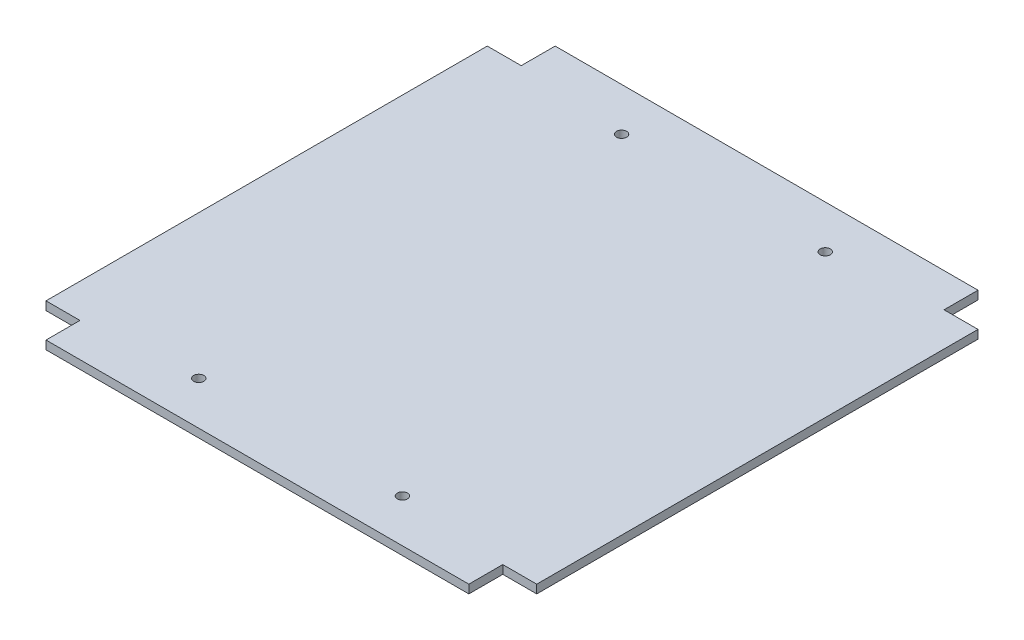
ISO-10303-21;
HEADER;
FILE_DESCRIPTION(('STEP AP214'),'2;1');
FILE_NAME('part.step','',(''),(''),'','','');
FILE_SCHEMA(('AUTOMOTIVE_DESIGN { 1 0 10303 214 1 1 1 1 }'));
ENDSEC;
DATA;
#1=APPLICATION_CONTEXT('core data for automotive mechanical design processes');
#2=APPLICATION_PROTOCOL_DEFINITION('international standard','automotive_design',2000,#1);
#3=PRODUCT_CONTEXT('',#1,'mechanical');
#4=PRODUCT('Part','Part','',(#3));
#5=PRODUCT_RELATED_PRODUCT_CATEGORY('part','',(#4));
#6=PRODUCT_DEFINITION_FORMATION('','',#4);
#7=PRODUCT_DEFINITION_CONTEXT('part definition',#1,'design');
#8=PRODUCT_DEFINITION('design','',#6,#7);
#9=PRODUCT_DEFINITION_SHAPE('','',#8);
#10=(LENGTH_UNIT() NAMED_UNIT(*) SI_UNIT(.MILLI.,.METRE.));
#11=(NAMED_UNIT(*) PLANE_ANGLE_UNIT() SI_UNIT($,.RADIAN.));
#12=(NAMED_UNIT(*) SI_UNIT($,.STERADIAN.) SOLID_ANGLE_UNIT());
#13=UNCERTAINTY_MEASURE_WITH_UNIT(LENGTH_MEASURE(1.E-05),#10,'distance_accuracy_value','');
#14=(GEOMETRIC_REPRESENTATION_CONTEXT(3) GLOBAL_UNCERTAINTY_ASSIGNED_CONTEXT((#13)) GLOBAL_UNIT_ASSIGNED_CONTEXT((#10,
#11,#12)) REPRESENTATION_CONTEXT('',''));
#15=CARTESIAN_POINT('',(0.,0.,0.));
#16=DIRECTION('',(0.,0.,1.));
#17=DIRECTION('',(1.,0.,0.));
#18=AXIS2_PLACEMENT_3D('',#15,#16,#17);
#19=CARTESIAN_POINT('',(-144.56832294801,5.,0.));
#20=DIRECTION('',(-1.,0.,0.));
#21=DIRECTION('',(0.,0.,1.));
#22=AXIS2_PLACEMENT_3D('',#19,#20,#21);
#23=PLANE('',#22);
#24=DIRECTION('',(0.,0.,-1.));
#25=VECTOR('',#24,1.);
#26=CARTESIAN_POINT('',(-144.56832294801,0.,0.));
#27=LINE('',#26,#25);
#28=CARTESIAN_POINT('',(-144.56832294801,0.,130.));
#29=VERTEX_POINT('',#28);
#30=CARTESIAN_POINT('',(-144.56832294801,0.,-130.));
#31=VERTEX_POINT('',#30);
#32=EDGE_CURVE('E169',#29,#31,#27,.T.);
#33=ORIENTED_EDGE('',*,*,#32,.F.);
#34=DIRECTION('',(0.,-1.,0.));
#35=VECTOR('',#34,1.);
#36=CARTESIAN_POINT('',(-144.56832294801,5.,130.));
#37=LINE('',#36,#35);
#38=CARTESIAN_POINT('',(-144.56832294801,5.,130.));
#39=VERTEX_POINT('',#38);
#40=EDGE_CURVE('E11',#39,#29,#37,.T.);
#41=ORIENTED_EDGE('',*,*,#40,.F.);
#42=DIRECTION('',(0.,0.,-1.));
#43=VECTOR('',#42,1.);
#44=CARTESIAN_POINT('',(-144.56832294801,5.,0.));
#45=LINE('',#44,#43);
#46=CARTESIAN_POINT('',(-144.56832294801,5.,-130.));
#47=VERTEX_POINT('',#46);
#48=EDGE_CURVE('E211',#39,#47,#45,.T.);
#49=ORIENTED_EDGE('',*,*,#48,.T.);
#50=DIRECTION('',(0.,-1.,0.));
#51=VECTOR('',#50,1.);
#52=CARTESIAN_POINT('',(-144.56832294801,5.,-130.));
#53=LINE('',#52,#51);
#54=EDGE_CURVE('E55',#47,#31,#53,.T.);
#55=ORIENTED_EDGE('',*,*,#54,.T.);
#56=EDGE_LOOP('',(#33,#41,#49,#55));
#57=FACE_BOUND('',#56,.T.);
#58=ADVANCED_FACE('F39',(#57),#23,.T.);
#59=CARTESIAN_POINT('',(0.,5.,130.));
#60=DIRECTION('',(0.,0.,-1.));
#61=DIRECTION('',(-1.,0.,0.));
#62=AXIS2_PLACEMENT_3D('',#59,#60,#61);
#63=PLANE('',#62);
#64=DIRECTION('',(1.,0.,0.));
#65=VECTOR('',#64,1.);
#66=CARTESIAN_POINT('',(0.,0.,130.));
#67=LINE('',#66,#65);
#68=CARTESIAN_POINT('',(-124.56832294801,0.,130.));
#69=VERTEX_POINT('',#68);
#70=EDGE_CURVE('E171',#29,#69,#67,.T.);
#71=ORIENTED_EDGE('',*,*,#70,.T.);
#72=DIRECTION('',(0.,-1.,0.));
#73=VECTOR('',#72,1.);
#74=CARTESIAN_POINT('',(-124.56832294801,5.,130.));
#75=LINE('',#74,#73);
#76=CARTESIAN_POINT('',(-124.56832294801,5.,130.));
#77=VERTEX_POINT('',#76);
#78=EDGE_CURVE('E47',#77,#69,#75,.T.);
#79=ORIENTED_EDGE('',*,*,#78,.F.);
#80=DIRECTION('',(1.,0.,0.));
#81=VECTOR('',#80,1.);
#82=CARTESIAN_POINT('',(0.,5.,130.));
#83=LINE('',#82,#81);
#84=EDGE_CURVE('E253',#39,#77,#83,.T.);
#85=ORIENTED_EDGE('',*,*,#84,.F.);
#86=ORIENTED_EDGE('',*,*,#40,.T.);
#87=EDGE_LOOP('',(#71,#79,#85,#86));
#88=FACE_BOUND('',#87,.T.);
#89=ADVANCED_FACE('F289',(#88),#63,.F.);
#90=CARTESIAN_POINT('',(-124.56832294801,5.,0.));
#91=DIRECTION('',(1.,0.,0.));
#92=DIRECTION('',(0.,0.,-1.));
#93=AXIS2_PLACEMENT_3D('',#90,#91,#92);
#94=PLANE('',#93);
#95=DIRECTION('',(0.,0.,1.));
#96=VECTOR('',#95,1.);
#97=CARTESIAN_POINT('',(-124.56832294801,0.,0.));
#98=LINE('',#97,#96);
#99=CARTESIAN_POINT('',(-124.56832294801,0.,150.));
#100=VERTEX_POINT('',#99);
#101=EDGE_CURVE('E173',#69,#100,#98,.T.);
#102=ORIENTED_EDGE('',*,*,#101,.T.);
#103=DIRECTION('',(0.,-1.,0.));
#104=VECTOR('',#103,1.);
#105=CARTESIAN_POINT('',(-124.56832294801,5.,150.));
#106=LINE('',#105,#104);
#107=CARTESIAN_POINT('',(-124.56832294801,5.,150.));
#108=VERTEX_POINT('',#107);
#109=EDGE_CURVE('E226',#108,#100,#106,.T.);
#110=ORIENTED_EDGE('',*,*,#109,.F.);
#111=DIRECTION('',(0.,0.,1.));
#112=VECTOR('',#111,1.);
#113=CARTESIAN_POINT('',(-124.56832294801,5.,0.));
#114=LINE('',#113,#112);
#115=EDGE_CURVE('E234',#77,#108,#114,.T.);
#116=ORIENTED_EDGE('',*,*,#115,.F.);
#117=ORIENTED_EDGE('',*,*,#78,.T.);
#118=EDGE_LOOP('',(#102,#110,#116,#117));
#119=FACE_BOUND('',#118,.T.);
#120=ADVANCED_FACE('F232',(#119),#94,.F.);
#121=CARTESIAN_POINT('',(0.,5.,150.));
#122=DIRECTION('',(0.,0.,1.));
#123=DIRECTION('',(1.,0.,0.));
#124=AXIS2_PLACEMENT_3D('',#121,#122,#123);
#125=PLANE('',#124);
#126=DIRECTION('',(-1.,0.,0.));
#127=VECTOR('',#126,1.);
#128=CARTESIAN_POINT('',(0.,0.,150.));
#129=LINE('',#128,#127);
#130=CARTESIAN_POINT('',(124.56832294801,0.,150.));
#131=VERTEX_POINT('',#130);
#132=EDGE_CURVE('E176',#131,#100,#129,.T.);
#133=ORIENTED_EDGE('',*,*,#132,.F.);
#134=DIRECTION('',(0.,-1.,0.));
#135=VECTOR('',#134,1.);
#136=CARTESIAN_POINT('',(124.56832294801,5.,150.));
#137=LINE('',#136,#135);
#138=CARTESIAN_POINT('',(124.56832294801,5.,150.));
#139=VERTEX_POINT('',#138);
#140=EDGE_CURVE('E224',#139,#131,#137,.T.);
#141=ORIENTED_EDGE('',*,*,#140,.F.);
#142=DIRECTION('',(-1.,0.,0.));
#143=VECTOR('',#142,1.);
#144=CARTESIAN_POINT('',(0.,5.,150.));
#145=LINE('',#144,#143);
#146=EDGE_CURVE('E246',#139,#108,#145,.T.);
#147=ORIENTED_EDGE('',*,*,#146,.T.);
#148=ORIENTED_EDGE('',*,*,#109,.T.);
#149=EDGE_LOOP('',(#133,#141,#147,#148));
#150=FACE_BOUND('',#149,.T.);
#151=ADVANCED_FACE('F243',(#150),#125,.T.);
#152=CARTESIAN_POINT('',(124.56832294801,5.,0.));
#153=DIRECTION('',(1.,0.,0.));
#154=DIRECTION('',(0.,0.,-1.));
#155=AXIS2_PLACEMENT_3D('',#152,#153,#154);
#156=PLANE('',#155);
#157=DIRECTION('',(0.,0.,1.));
#158=VECTOR('',#157,1.);
#159=CARTESIAN_POINT('',(124.56832294801,0.,0.));
#160=LINE('',#159,#158);
#161=CARTESIAN_POINT('',(124.56832294801,0.,130.));
#162=VERTEX_POINT('',#161);
#163=EDGE_CURVE('E179',#162,#131,#160,.T.);
#164=ORIENTED_EDGE('',*,*,#163,.F.);
#165=DIRECTION('',(0.,-1.,0.));
#166=VECTOR('',#165,1.);
#167=CARTESIAN_POINT('',(124.56832294801,5.,130.));
#168=LINE('',#167,#166);
#169=CARTESIAN_POINT('',(124.56832294801,5.,130.));
#170=VERTEX_POINT('',#169);
#171=EDGE_CURVE('E222',#170,#162,#168,.T.);
#172=ORIENTED_EDGE('',*,*,#171,.F.);
#173=DIRECTION('',(0.,0.,1.));
#174=VECTOR('',#173,1.);
#175=CARTESIAN_POINT('',(124.56832294801,5.,0.));
#176=LINE('',#175,#174);
#177=EDGE_CURVE('E249',#170,#139,#176,.T.);
#178=ORIENTED_EDGE('',*,*,#177,.T.);
#179=ORIENTED_EDGE('',*,*,#140,.T.);
#180=EDGE_LOOP('',(#164,#172,#178,#179));
#181=FACE_BOUND('',#180,.T.);
#182=ADVANCED_FACE('F300',(#181),#156,.T.);
#183=CARTESIAN_POINT('',(0.,5.,130.));
#184=DIRECTION('',(0.,0.,1.));
#185=DIRECTION('',(1.,0.,0.));
#186=AXIS2_PLACEMENT_3D('',#183,#184,#185);
#187=PLANE('',#186);
#188=DIRECTION('',(-1.,0.,0.));
#189=VECTOR('',#188,1.);
#190=CARTESIAN_POINT('',(0.,0.,130.));
#191=LINE('',#190,#189);
#192=CARTESIAN_POINT('',(144.56832294801,0.,130.));
#193=VERTEX_POINT('',#192);
#194=EDGE_CURVE('E182',#193,#162,#191,.T.);
#195=ORIENTED_EDGE('',*,*,#194,.F.);
#196=DIRECTION('',(0.,-1.,0.));
#197=VECTOR('',#196,1.);
#198=CARTESIAN_POINT('',(144.56832294801,5.,130.));
#199=LINE('',#198,#197);
#200=CARTESIAN_POINT('',(144.56832294801,5.,130.));
#201=VERTEX_POINT('',#200);
#202=EDGE_CURVE('E220',#201,#193,#199,.T.);
#203=ORIENTED_EDGE('',*,*,#202,.F.);
#204=DIRECTION('',(-1.,0.,0.));
#205=VECTOR('',#204,1.);
#206=CARTESIAN_POINT('',(0.,5.,130.));
#207=LINE('',#206,#205);
#208=EDGE_CURVE('E251',#201,#170,#207,.T.);
#209=ORIENTED_EDGE('',*,*,#208,.T.);
#210=ORIENTED_EDGE('',*,*,#171,.T.);
#211=EDGE_LOOP('',(#195,#203,#209,#210));
#212=FACE_BOUND('',#211,.T.);
#213=ADVANCED_FACE('F303',(#212),#187,.T.);
#214=CARTESIAN_POINT('',(144.56832294801,5.,0.));
#215=DIRECTION('',(1.,0.,0.));
#216=DIRECTION('',(0.,0.,-1.));
#217=AXIS2_PLACEMENT_3D('',#214,#215,#216);
#218=PLANE('',#217);
#219=DIRECTION('',(0.,0.,1.));
#220=VECTOR('',#219,1.);
#221=CARTESIAN_POINT('',(144.56832294801,0.,0.));
#222=LINE('',#221,#220);
#223=CARTESIAN_POINT('',(144.56832294801,0.,-130.));
#224=VERTEX_POINT('',#223);
#225=EDGE_CURVE('E185',#224,#193,#222,.T.);
#226=ORIENTED_EDGE('',*,*,#225,.F.);
#227=DIRECTION('',(0.,-1.,0.));
#228=VECTOR('',#227,1.);
#229=CARTESIAN_POINT('',(144.56832294801,5.,-130.));
#230=LINE('',#229,#228);
#231=CARTESIAN_POINT('',(144.56832294801,5.,-130.));
#232=VERTEX_POINT('',#231);
#233=EDGE_CURVE('E218',#232,#224,#230,.T.);
#234=ORIENTED_EDGE('',*,*,#233,.F.);
#235=DIRECTION('',(0.,0.,1.));
#236=VECTOR('',#235,1.);
#237=CARTESIAN_POINT('',(144.56832294801,5.,0.));
#238=LINE('',#237,#236);
#239=EDGE_CURVE('E259',#232,#201,#238,.T.);
#240=ORIENTED_EDGE('',*,*,#239,.T.);
#241=ORIENTED_EDGE('',*,*,#202,.T.);
#242=EDGE_LOOP('',(#226,#234,#240,#241));
#243=FACE_BOUND('',#242,.T.);
#244=ADVANCED_FACE('F307',(#243),#218,.T.);
#245=CARTESIAN_POINT('',(0.,5.,-130.));
#246=DIRECTION('',(0.,0.,1.));
#247=DIRECTION('',(1.,0.,0.));
#248=AXIS2_PLACEMENT_3D('',#245,#246,#247);
#249=PLANE('',#248);
#250=DIRECTION('',(-1.,0.,0.));
#251=VECTOR('',#250,1.);
#252=CARTESIAN_POINT('',(0.,0.,-130.));
#253=LINE('',#252,#251);
#254=CARTESIAN_POINT('',(124.56832294801,0.,-130.));
#255=VERTEX_POINT('',#254);
#256=EDGE_CURVE('E188',#224,#255,#253,.T.);
#257=ORIENTED_EDGE('',*,*,#256,.T.);
#258=DIRECTION('',(0.,-1.,0.));
#259=VECTOR('',#258,1.);
#260=CARTESIAN_POINT('',(124.56832294801,5.,-130.));
#261=LINE('',#260,#259);
#262=CARTESIAN_POINT('',(124.56832294801,5.,-130.));
#263=VERTEX_POINT('',#262);
#264=EDGE_CURVE('E215',#263,#255,#261,.T.);
#265=ORIENTED_EDGE('',*,*,#264,.F.);
#266=DIRECTION('',(-1.,0.,0.));
#267=VECTOR('',#266,1.);
#268=CARTESIAN_POINT('',(0.,5.,-130.));
#269=LINE('',#268,#267);
#270=EDGE_CURVE('E262',#232,#263,#269,.T.);
#271=ORIENTED_EDGE('',*,*,#270,.F.);
#272=ORIENTED_EDGE('',*,*,#233,.T.);
#273=EDGE_LOOP('',(#257,#265,#271,#272));
#274=FACE_BOUND('',#273,.T.);
#275=ADVANCED_FACE('F268',(#274),#249,.F.);
#276=CARTESIAN_POINT('',(124.56832294801,5.,0.));
#277=DIRECTION('',(-1.,0.,0.));
#278=DIRECTION('',(0.,0.,1.));
#279=AXIS2_PLACEMENT_3D('',#276,#277,#278);
#280=PLANE('',#279);
#281=DIRECTION('',(0.,0.,-1.));
#282=VECTOR('',#281,1.);
#283=CARTESIAN_POINT('',(124.56832294801,0.,0.));
#284=LINE('',#283,#282);
#285=CARTESIAN_POINT('',(124.56832294801,0.,-150.));
#286=VERTEX_POINT('',#285);
#287=EDGE_CURVE('E190',#255,#286,#284,.T.);
#288=ORIENTED_EDGE('',*,*,#287,.T.);
#289=DIRECTION('',(0.,-1.,0.));
#290=VECTOR('',#289,1.);
#291=CARTESIAN_POINT('',(124.56832294801,5.,-150.));
#292=LINE('',#291,#290);
#293=CARTESIAN_POINT('',(124.56832294801,5.,-150.));
#294=VERTEX_POINT('',#293);
#295=EDGE_CURVE('E138',#294,#286,#292,.T.);
#296=ORIENTED_EDGE('',*,*,#295,.F.);
#297=DIRECTION('',(0.,0.,-1.));
#298=VECTOR('',#297,1.);
#299=CARTESIAN_POINT('',(124.56832294801,5.,0.));
#300=LINE('',#299,#298);
#301=EDGE_CURVE('E148',#263,#294,#300,.T.);
#302=ORIENTED_EDGE('',*,*,#301,.F.);
#303=ORIENTED_EDGE('',*,*,#264,.T.);
#304=EDGE_LOOP('',(#288,#296,#302,#303));
#305=FACE_BOUND('',#304,.T.);
#306=ADVANCED_FACE('F272',(#305),#280,.F.);
#307=CARTESIAN_POINT('',(0.,5.,-150.));
#308=DIRECTION('',(0.,0.,-1.));
#309=DIRECTION('',(-1.,0.,0.));
#310=AXIS2_PLACEMENT_3D('',#307,#308,#309);
#311=PLANE('',#310);
#312=DIRECTION('',(1.,0.,0.));
#313=VECTOR('',#312,1.);
#314=CARTESIAN_POINT('',(0.,0.,-150.));
#315=LINE('',#314,#313);
#316=CARTESIAN_POINT('',(-124.56832294801,0.,-150.));
#317=VERTEX_POINT('',#316);
#318=EDGE_CURVE('E134',#317,#286,#315,.T.);
#319=ORIENTED_EDGE('',*,*,#318,.F.);
#320=DIRECTION('',(0.,-1.,0.));
#321=VECTOR('',#320,1.);
#322=CARTESIAN_POINT('',(-124.56832294801,5.,-150.));
#323=LINE('',#322,#321);
#324=CARTESIAN_POINT('',(-124.56832294801,5.,-150.));
#325=VERTEX_POINT('',#324);
#326=EDGE_CURVE('E129',#325,#317,#323,.T.);
#327=ORIENTED_EDGE('',*,*,#326,.F.);
#328=DIRECTION('',(1.,0.,0.));
#329=VECTOR('',#328,1.);
#330=CARTESIAN_POINT('',(0.,5.,-150.));
#331=LINE('',#330,#329);
#332=EDGE_CURVE('E132',#325,#294,#331,.T.);
#333=ORIENTED_EDGE('',*,*,#332,.T.);
#334=ORIENTED_EDGE('',*,*,#295,.T.);
#335=EDGE_LOOP('',(#319,#327,#333,#334));
#336=FACE_BOUND('',#335,.T.);
#337=ADVANCED_FACE('F131',(#336),#311,.T.);
#338=CARTESIAN_POINT('',(-124.56832294801,5.,0.));
#339=DIRECTION('',(-1.,0.,0.));
#340=DIRECTION('',(0.,0.,1.));
#341=AXIS2_PLACEMENT_3D('',#338,#339,#340);
#342=PLANE('',#341);
#343=DIRECTION('',(0.,0.,-1.));
#344=VECTOR('',#343,1.);
#345=CARTESIAN_POINT('',(-124.56832294801,0.,0.));
#346=LINE('',#345,#344);
#347=CARTESIAN_POINT('',(-124.56832294801,0.,-130.));
#348=VERTEX_POINT('',#347);
#349=EDGE_CURVE('E194',#348,#317,#346,.T.);
#350=ORIENTED_EDGE('',*,*,#349,.F.);
#351=DIRECTION('',(0.,-1.,0.));
#352=VECTOR('',#351,1.);
#353=CARTESIAN_POINT('',(-124.56832294801,5.,-130.));
#354=LINE('',#353,#352);
#355=CARTESIAN_POINT('',(-124.56832294801,5.,-130.));
#356=VERTEX_POINT('',#355);
#357=EDGE_CURVE('E92',#356,#348,#354,.T.);
#358=ORIENTED_EDGE('',*,*,#357,.F.);
#359=DIRECTION('',(0.,0.,-1.));
#360=VECTOR('',#359,1.);
#361=CARTESIAN_POINT('',(-124.56832294801,5.,0.));
#362=LINE('',#361,#360);
#363=EDGE_CURVE('E146',#356,#325,#362,.T.);
#364=ORIENTED_EDGE('',*,*,#363,.T.);
#365=ORIENTED_EDGE('',*,*,#326,.T.);
#366=EDGE_LOOP('',(#350,#358,#364,#365));
#367=FACE_BOUND('',#366,.T.);
#368=ADVANCED_FACE('F151',(#367),#342,.T.);
#369=CARTESIAN_POINT('',(60.,5.,124.57));
#370=DIRECTION('',(0.,-1.,0.));
#371=DIRECTION('',(0.,0.,-1.));
#372=AXIS2_PLACEMENT_3D('',#369,#370,#371);
#373=CYLINDRICAL_SURFACE('',#372,3.00000000000001);
#374=CARTESIAN_POINT('',(60.,5.,124.57));
#375=DIRECTION('',(0.,1.,0.));
#376=DIRECTION('',(0.,0.,1.));
#377=AXIS2_PLACEMENT_3D('',#374,#375,#376);
#378=CIRCLE('',#377,3.00000000000001);
#379=CARTESIAN_POINT('',(60.,5.,127.57));
#380=VERTEX_POINT('',#379);
#381=EDGE_CURVE('E163',#380,#380,#378,.T.);
#382=ORIENTED_EDGE('',*,*,#381,.T.);
#383=EDGE_LOOP('',(#382));
#384=FACE_BOUND('',#383,.T.);
#385=CARTESIAN_POINT('',(60.,0.,124.57));
#386=DIRECTION('',(0.,1.,0.));
#387=DIRECTION('',(0.,0.,1.));
#388=AXIS2_PLACEMENT_3D('',#385,#386,#387);
#389=CIRCLE('',#388,3.00000000000001);
#390=CARTESIAN_POINT('',(60.,0.,127.57));
#391=VERTEX_POINT('',#390);
#392=EDGE_CURVE('E205',#391,#391,#389,.T.);
#393=ORIENTED_EDGE('',*,*,#392,.F.);
#394=EDGE_LOOP('',(#393));
#395=FACE_BOUND('',#394,.T.);
#396=ADVANCED_FACE('F318',(#384,#395),#373,.F.);
#397=CARTESIAN_POINT('',(-60.,5.,-124.57));
#398=DIRECTION('',(0.,-1.,0.));
#399=DIRECTION('',(0.,0.,-1.));
#400=AXIS2_PLACEMENT_3D('',#397,#398,#399);
#401=CYLINDRICAL_SURFACE('',#400,3.00000000000001);
#402=CARTESIAN_POINT('',(-60.,5.,-124.57));
#403=DIRECTION('',(0.,1.,0.));
#404=DIRECTION('',(0.,0.,1.));
#405=AXIS2_PLACEMENT_3D('',#402,#403,#404);
#406=CIRCLE('',#405,3.00000000000001);
#407=CARTESIAN_POINT('',(-60.,5.,-121.57));
#408=VERTEX_POINT('',#407);
#409=EDGE_CURVE('E160',#408,#408,#406,.T.);
#410=ORIENTED_EDGE('',*,*,#409,.T.);
#411=EDGE_LOOP('',(#410));
#412=FACE_BOUND('',#411,.T.);
#413=CARTESIAN_POINT('',(-60.,0.,-124.57));
#414=DIRECTION('',(0.,1.,0.));
#415=DIRECTION('',(0.,0.,1.));
#416=AXIS2_PLACEMENT_3D('',#413,#414,#415);
#417=CIRCLE('',#416,3.00000000000001);
#418=CARTESIAN_POINT('',(-60.,0.,-121.57));
#419=VERTEX_POINT('',#418);
#420=EDGE_CURVE('E202',#419,#419,#417,.T.);
#421=ORIENTED_EDGE('',*,*,#420,.F.);
#422=EDGE_LOOP('',(#421));
#423=FACE_BOUND('',#422,.T.);
#424=ADVANCED_FACE('F284',(#412,#423),#401,.F.);
#425=CARTESIAN_POINT('',(60.,5.,-124.57));
#426=DIRECTION('',(0.,-1.,0.));
#427=DIRECTION('',(0.,0.,-1.));
#428=AXIS2_PLACEMENT_3D('',#425,#426,#427);
#429=CYLINDRICAL_SURFACE('',#428,3.);
#430=CARTESIAN_POINT('',(60.,5.,-124.57));
#431=DIRECTION('',(0.,1.,0.));
#432=DIRECTION('',(0.,0.,1.));
#433=AXIS2_PLACEMENT_3D('',#430,#431,#432);
#434=CIRCLE('',#433,3.);
#435=CARTESIAN_POINT('',(60.,5.,-121.57));
#436=VERTEX_POINT('',#435);
#437=EDGE_CURVE('E154',#436,#436,#434,.F.);
#438=ORIENTED_EDGE('',*,*,#437,.F.);
#439=EDGE_LOOP('',(#438));
#440=FACE_BOUND('',#439,.T.);
#441=CARTESIAN_POINT('',(60.,0.,-124.57));
#442=DIRECTION('',(0.,1.,0.));
#443=DIRECTION('',(0.,0.,1.));
#444=AXIS2_PLACEMENT_3D('',#441,#442,#443);
#445=CIRCLE('',#444,3.);
#446=CARTESIAN_POINT('',(60.,0.,-121.57));
#447=VERTEX_POINT('',#446);
#448=EDGE_CURVE('E199',#447,#447,#445,.F.);
#449=ORIENTED_EDGE('',*,*,#448,.T.);
#450=EDGE_LOOP('',(#449));
#451=FACE_BOUND('',#450,.T.);
#452=ADVANCED_FACE('F276',(#440,#451),#429,.F.);
#453=CARTESIAN_POINT('',(0.,5.,-130.));
#454=DIRECTION('',(0.,0.,-1.));
#455=DIRECTION('',(-1.,0.,0.));
#456=AXIS2_PLACEMENT_3D('',#453,#454,#455);
#457=PLANE('',#456);
#458=DIRECTION('',(1.,0.,0.));
#459=VECTOR('',#458,1.);
#460=CARTESIAN_POINT('',(0.,0.,-130.));
#461=LINE('',#460,#459);
#462=EDGE_CURVE('E196',#31,#348,#461,.T.);
#463=ORIENTED_EDGE('',*,*,#462,.F.);
#464=ORIENTED_EDGE('',*,*,#54,.F.);
#465=DIRECTION('',(1.,0.,0.));
#466=VECTOR('',#465,1.);
#467=CARTESIAN_POINT('',(0.,5.,-130.));
#468=LINE('',#467,#466);
#469=EDGE_CURVE('E152',#47,#356,#468,.T.);
#470=ORIENTED_EDGE('',*,*,#469,.T.);
#471=ORIENTED_EDGE('',*,*,#357,.T.);
#472=EDGE_LOOP('',(#463,#464,#470,#471));
#473=FACE_BOUND('',#472,.T.);
#474=ADVANCED_FACE('F273',(#473),#457,.T.);
#475=CARTESIAN_POINT('',(-60.,5.,124.57));
#476=DIRECTION('',(0.,-1.,0.));
#477=DIRECTION('',(0.,0.,-1.));
#478=AXIS2_PLACEMENT_3D('',#475,#476,#477);
#479=CYLINDRICAL_SURFACE('',#478,3.00000000000001);
#480=CARTESIAN_POINT('',(-60.,5.,124.57));
#481=DIRECTION('',(0.,1.,0.));
#482=DIRECTION('',(0.,0.,1.));
#483=AXIS2_PLACEMENT_3D('',#480,#481,#482);
#484=CIRCLE('',#483,3.00000000000001);
#485=CARTESIAN_POINT('',(-60.,5.,127.57));
#486=VERTEX_POINT('',#485);
#487=EDGE_CURVE('E166',#486,#486,#484,.F.);
#488=ORIENTED_EDGE('',*,*,#487,.F.);
#489=EDGE_LOOP('',(#488));
#490=FACE_BOUND('',#489,.T.);
#491=CARTESIAN_POINT('',(-60.,0.,124.57));
#492=DIRECTION('',(0.,1.,0.));
#493=DIRECTION('',(0.,0.,1.));
#494=AXIS2_PLACEMENT_3D('',#491,#492,#493);
#495=CIRCLE('',#494,3.00000000000001);
#496=CARTESIAN_POINT('',(-60.,0.,127.57));
#497=VERTEX_POINT('',#496);
#498=EDGE_CURVE('E208',#497,#497,#495,.F.);
#499=ORIENTED_EDGE('',*,*,#498,.T.);
#500=EDGE_LOOP('',(#499));
#501=FACE_BOUND('',#500,.T.);
#502=ADVANCED_FACE('F275',(#490,#501),#479,.F.);
#503=CARTESIAN_POINT('',(0.,5.,0.));
#504=DIRECTION('',(0.,1.,0.));
#505=DIRECTION('',(0.,0.,1.));
#506=AXIS2_PLACEMENT_3D('',#503,#504,#505);
#507=PLANE('',#506);
#508=ORIENTED_EDGE('',*,*,#48,.F.);
#509=ORIENTED_EDGE('',*,*,#84,.T.);
#510=ORIENTED_EDGE('',*,*,#115,.T.);
#511=ORIENTED_EDGE('',*,*,#146,.F.);
#512=ORIENTED_EDGE('',*,*,#177,.F.);
#513=ORIENTED_EDGE('',*,*,#208,.F.);
#514=ORIENTED_EDGE('',*,*,#239,.F.);
#515=ORIENTED_EDGE('',*,*,#270,.T.);
#516=ORIENTED_EDGE('',*,*,#301,.T.);
#517=ORIENTED_EDGE('',*,*,#332,.F.);
#518=ORIENTED_EDGE('',*,*,#363,.F.);
#519=ORIENTED_EDGE('',*,*,#469,.F.);
#520=EDGE_LOOP('',(#508,#509,#510,#511,#512,#513,#514,#515,#516,#517,#518,#519));
#521=FACE_BOUND('',#520,.T.);
#522=ORIENTED_EDGE('',*,*,#437,.T.);
#523=EDGE_LOOP('',(#522));
#524=FACE_BOUND('',#523,.T.);
#525=ORIENTED_EDGE('',*,*,#409,.F.);
#526=EDGE_LOOP('',(#525));
#527=FACE_BOUND('',#526,.T.);
#528=ORIENTED_EDGE('',*,*,#381,.F.);
#529=EDGE_LOOP('',(#528));
#530=FACE_BOUND('',#529,.T.);
#531=ORIENTED_EDGE('',*,*,#487,.T.);
#532=EDGE_LOOP('',(#531));
#533=FACE_BOUND('',#532,.T.);
#534=ADVANCED_FACE('F143',(#521,#524,#527,#530,#533),#507,.T.);
#535=CARTESIAN_POINT('',(0.,0.,0.));
#536=DIRECTION('',(0.,1.,0.));
#537=DIRECTION('',(0.,0.,1.));
#538=AXIS2_PLACEMENT_3D('',#535,#536,#537);
#539=PLANE('',#538);
#540=ORIENTED_EDGE('',*,*,#32,.T.);
#541=ORIENTED_EDGE('',*,*,#462,.T.);
#542=ORIENTED_EDGE('',*,*,#349,.T.);
#543=ORIENTED_EDGE('',*,*,#318,.T.);
#544=ORIENTED_EDGE('',*,*,#287,.F.);
#545=ORIENTED_EDGE('',*,*,#256,.F.);
#546=ORIENTED_EDGE('',*,*,#225,.T.);
#547=ORIENTED_EDGE('',*,*,#194,.T.);
#548=ORIENTED_EDGE('',*,*,#163,.T.);
#549=ORIENTED_EDGE('',*,*,#132,.T.);
#550=ORIENTED_EDGE('',*,*,#101,.F.);
#551=ORIENTED_EDGE('',*,*,#70,.F.);
#552=EDGE_LOOP('',(#540,#541,#542,#543,#544,#545,#546,#547,#548,#549,#550,#551));
#553=FACE_BOUND('',#552,.T.);
#554=ORIENTED_EDGE('',*,*,#448,.F.);
#555=EDGE_LOOP('',(#554));
#556=FACE_BOUND('',#555,.T.);
#557=ORIENTED_EDGE('',*,*,#420,.T.);
#558=EDGE_LOOP('',(#557));
#559=FACE_BOUND('',#558,.T.);
#560=ORIENTED_EDGE('',*,*,#392,.T.);
#561=EDGE_LOOP('',(#560));
#562=FACE_BOUND('',#561,.T.);
#563=ORIENTED_EDGE('',*,*,#498,.F.);
#564=EDGE_LOOP('',(#563));
#565=FACE_BOUND('',#564,.T.);
#566=ADVANCED_FACE('F238',(#553,#556,#559,#562,#565),#539,.F.);
#567=CLOSED_SHELL('',(#58,#89,#120,#151,#182,#213,#244,#275,#306,#337,#368,#396,#424,#452,#474,
#502,#534,#566));
#568=MANIFOLD_SOLID_BREP('B2',#567);
#569=ADVANCED_BREP_SHAPE_REPRESENTATION('',(#18,#568),#14);
#570=SHAPE_DEFINITION_REPRESENTATION(#9,#569);
ENDSEC;
END-ISO-10303-21;
